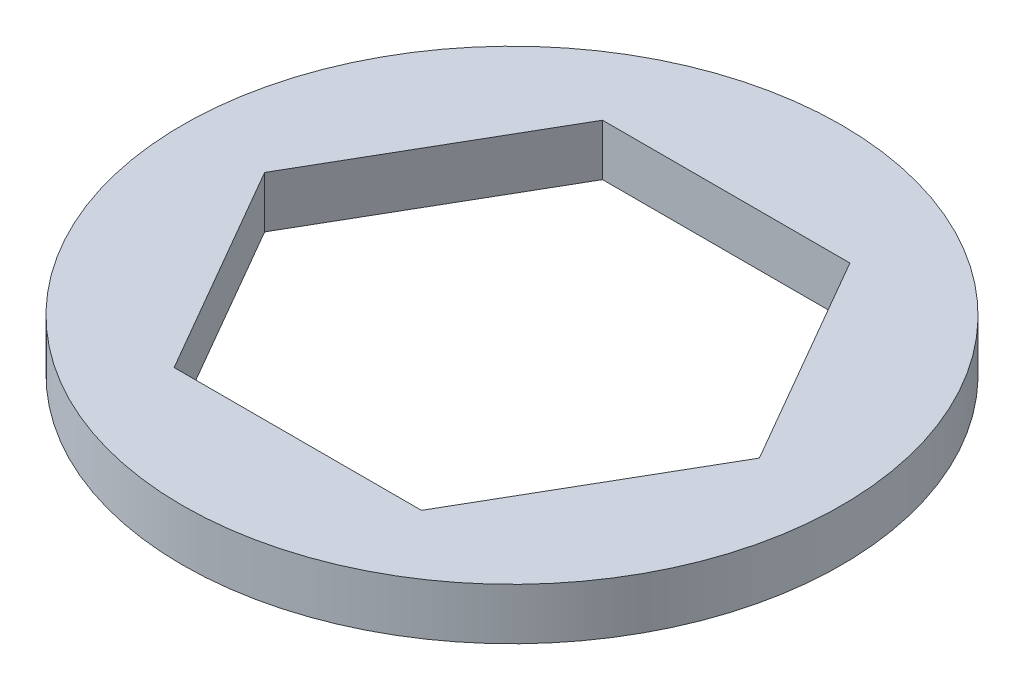
ISO-10303-21;
HEADER;
FILE_DESCRIPTION(('STEP AP214'),'2;1');
FILE_NAME('part.step','',(''),(''),'','','');
FILE_SCHEMA(('AUTOMOTIVE_DESIGN { 1 0 10303 214 1 1 1 1 }'));
ENDSEC;
DATA;
#1=APPLICATION_CONTEXT('core data for automotive mechanical design processes');
#2=APPLICATION_PROTOCOL_DEFINITION('international standard','automotive_design',2000,#1);
#3=PRODUCT_CONTEXT('',#1,'mechanical');
#4=PRODUCT('Part','Part','',(#3));
#5=PRODUCT_RELATED_PRODUCT_CATEGORY('part','',(#4));
#6=PRODUCT_DEFINITION_FORMATION('','',#4);
#7=PRODUCT_DEFINITION_CONTEXT('part definition',#1,'design');
#8=PRODUCT_DEFINITION('design','',#6,#7);
#9=PRODUCT_DEFINITION_SHAPE('','',#8);
#10=(LENGTH_UNIT() NAMED_UNIT(*) SI_UNIT(.MILLI.,.METRE.));
#11=(NAMED_UNIT(*) PLANE_ANGLE_UNIT() SI_UNIT($,.RADIAN.));
#12=(NAMED_UNIT(*) SI_UNIT($,.STERADIAN.) SOLID_ANGLE_UNIT());
#13=UNCERTAINTY_MEASURE_WITH_UNIT(LENGTH_MEASURE(1.E-05),#10,'distance_accuracy_value','');
#14=(GEOMETRIC_REPRESENTATION_CONTEXT(3) GLOBAL_UNCERTAINTY_ASSIGNED_CONTEXT((#13)) GLOBAL_UNIT_ASSIGNED_CONTEXT((#10,
#11,#12)) REPRESENTATION_CONTEXT('',''));
#15=CARTESIAN_POINT('',(0.,0.,0.));
#16=DIRECTION('',(0.,0.,1.));
#17=DIRECTION('',(1.,0.,0.));
#18=AXIS2_PLACEMENT_3D('',#15,#16,#17);
#19=CARTESIAN_POINT('',(0.,0.79375,0.));
#20=DIRECTION('',(0.,1.,0.));
#21=DIRECTION('',(0.,0.,1.));
#22=AXIS2_PLACEMENT_3D('',#19,#20,#21);
#23=PLANE('',#22);
#24=CARTESIAN_POINT('',(0.,0.79375,0.));
#25=DIRECTION('',(0.,1.,0.));
#26=DIRECTION('',(0.,0.,1.));
#27=AXIS2_PLACEMENT_3D('',#24,#25,#26);
#28=CIRCLE('',#27,10.16);
#29=CARTESIAN_POINT('',(0.,0.79375,10.16));
#30=VERTEX_POINT('',#29);
#31=EDGE_CURVE('E11',#30,#30,#28,.T.);
#32=ORIENTED_EDGE('',*,*,#31,.T.);
#33=EDGE_LOOP('',(#32));
#34=FACE_BOUND('',#33,.T.);
#35=DIRECTION('',(-0.5,0.,-0.866025403784439));
#36=VECTOR('',#35,1.);
#37=CARTESIAN_POINT('',(7.62564235545658,0.79375,0.));
#38=LINE('',#37,#36);
#39=CARTESIAN_POINT('',(7.62564235545658,0.79375,0.));
#40=VERTEX_POINT('',#39);
#41=CARTESIAN_POINT('',(3.81282117772829,0.79375,-6.604));
#42=VERTEX_POINT('',#41);
#43=EDGE_CURVE('E98',#40,#42,#38,.T.);
#44=ORIENTED_EDGE('',*,*,#43,.F.);
#45=DIRECTION('',(0.5,0.,-0.866025403784439));
#46=VECTOR('',#45,1.);
#47=CARTESIAN_POINT('',(3.81282117772829,0.79375,6.604));
#48=LINE('',#47,#46);
#49=CARTESIAN_POINT('',(3.81282117772829,0.79375,6.604));
#50=VERTEX_POINT('',#49);
#51=EDGE_CURVE('E90',#50,#40,#48,.T.);
#52=ORIENTED_EDGE('',*,*,#51,.F.);
#53=DIRECTION('',(1.,0.,0.));
#54=VECTOR('',#53,1.);
#55=CARTESIAN_POINT('',(-3.81282117772829,0.79375,6.604));
#56=LINE('',#55,#54);
#57=CARTESIAN_POINT('',(-3.81282117772829,0.79375,6.604));
#58=VERTEX_POINT('',#57);
#59=EDGE_CURVE('E118',#58,#50,#56,.T.);
#60=ORIENTED_EDGE('',*,*,#59,.F.);
#61=DIRECTION('',(0.5,0.,0.866025403784439));
#62=VECTOR('',#61,1.);
#63=CARTESIAN_POINT('',(-7.62564235545658,0.79375,0.));
#64=LINE('',#63,#62);
#65=CARTESIAN_POINT('',(-7.62564235545658,0.79375,0.));
#66=VERTEX_POINT('',#65);
#67=EDGE_CURVE('E116',#66,#58,#64,.T.);
#68=ORIENTED_EDGE('',*,*,#67,.F.);
#69=DIRECTION('',(-0.5,0.,0.866025403784439));
#70=VECTOR('',#69,1.);
#71=CARTESIAN_POINT('',(-3.81282117772829,0.79375,-6.604));
#72=LINE('',#71,#70);
#73=CARTESIAN_POINT('',(-3.81282117772829,0.79375,-6.604));
#74=VERTEX_POINT('',#73);
#75=EDGE_CURVE('E112',#74,#66,#72,.T.);
#76=ORIENTED_EDGE('',*,*,#75,.F.);
#77=DIRECTION('',(-1.,0.,0.));
#78=VECTOR('',#77,1.);
#79=CARTESIAN_POINT('',(3.81282117772829,0.79375,-6.604));
#80=LINE('',#79,#78);
#81=EDGE_CURVE('E110',#42,#74,#80,.T.);
#82=ORIENTED_EDGE('',*,*,#81,.F.);
#83=EDGE_LOOP('',(#44,#52,#60,#68,#76,#82));
#84=FACE_BOUND('',#83,.T.);
#85=ADVANCED_FACE('F37',(#34,#84),#23,.T.);
#86=CARTESIAN_POINT('',(0.,-0.79375,0.));
#87=DIRECTION('',(0.,1.,0.));
#88=DIRECTION('',(0.,0.,1.));
#89=AXIS2_PLACEMENT_3D('',#86,#87,#88);
#90=PLANE('',#89);
#91=CARTESIAN_POINT('',(0.,-0.79375,0.));
#92=DIRECTION('',(0.,1.,0.));
#93=DIRECTION('',(0.,0.,1.));
#94=AXIS2_PLACEMENT_3D('',#91,#92,#93);
#95=CIRCLE('',#94,10.16);
#96=CARTESIAN_POINT('',(0.,-0.79375,10.16));
#97=VERTEX_POINT('',#96);
#98=EDGE_CURVE('E41',#97,#97,#95,.T.);
#99=ORIENTED_EDGE('',*,*,#98,.F.);
#100=EDGE_LOOP('',(#99));
#101=FACE_BOUND('',#100,.T.);
#102=DIRECTION('',(0.5,0.,-0.866025403784439));
#103=VECTOR('',#102,1.);
#104=CARTESIAN_POINT('',(3.81282117772829,-0.79375,6.604));
#105=LINE('',#104,#103);
#106=CARTESIAN_POINT('',(3.81282117772829,-0.79375,6.604));
#107=VERTEX_POINT('',#106);
#108=CARTESIAN_POINT('',(7.62564235545658,-0.79375,0.));
#109=VERTEX_POINT('',#108);
#110=EDGE_CURVE('E60',#107,#109,#105,.T.);
#111=ORIENTED_EDGE('',*,*,#110,.T.);
#112=DIRECTION('',(-0.5,0.,-0.866025403784439));
#113=VECTOR('',#112,1.);
#114=CARTESIAN_POINT('',(7.62564235545658,-0.79375,0.));
#115=LINE('',#114,#113);
#116=CARTESIAN_POINT('',(3.81282117772829,-0.79375,-6.604));
#117=VERTEX_POINT('',#116);
#118=EDGE_CURVE('E105',#109,#117,#115,.T.);
#119=ORIENTED_EDGE('',*,*,#118,.T.);
#120=DIRECTION('',(-1.,0.,0.));
#121=VECTOR('',#120,1.);
#122=CARTESIAN_POINT('',(3.81282117772829,-0.79375,-6.604));
#123=LINE('',#122,#121);
#124=CARTESIAN_POINT('',(-3.81282117772829,-0.79375,-6.604));
#125=VERTEX_POINT('',#124);
#126=EDGE_CURVE('E122',#117,#125,#123,.T.);
#127=ORIENTED_EDGE('',*,*,#126,.T.);
#128=DIRECTION('',(-0.5,0.,0.866025403784439));
#129=VECTOR('',#128,1.);
#130=CARTESIAN_POINT('',(-3.81282117772829,-0.79375,-6.604));
#131=LINE('',#130,#129);
#132=CARTESIAN_POINT('',(-7.62564235545658,-0.79375,0.));
#133=VERTEX_POINT('',#132);
#134=EDGE_CURVE('E125',#125,#133,#131,.T.);
#135=ORIENTED_EDGE('',*,*,#134,.T.);
#136=DIRECTION('',(0.5,0.,0.866025403784439));
#137=VECTOR('',#136,1.);
#138=CARTESIAN_POINT('',(-7.62564235545658,-0.79375,0.));
#139=LINE('',#138,#137);
#140=CARTESIAN_POINT('',(-3.81282117772829,-0.79375,6.604));
#141=VERTEX_POINT('',#140);
#142=EDGE_CURVE('E128',#133,#141,#139,.T.);
#143=ORIENTED_EDGE('',*,*,#142,.T.);
#144=DIRECTION('',(1.,0.,0.));
#145=VECTOR('',#144,1.);
#146=CARTESIAN_POINT('',(-3.81282117772829,-0.79375,6.604));
#147=LINE('',#146,#145);
#148=EDGE_CURVE('E99',#141,#107,#147,.T.);
#149=ORIENTED_EDGE('',*,*,#148,.T.);
#150=EDGE_LOOP('',(#111,#119,#127,#135,#143,#149));
#151=FACE_BOUND('',#150,.T.);
#152=ADVANCED_FACE('F145',(#101,#151),#90,.F.);
#153=CARTESIAN_POINT('',(0.,0.79375,0.));
#154=DIRECTION('',(0.,-1.,0.));
#155=DIRECTION('',(0.,0.,-1.));
#156=AXIS2_PLACEMENT_3D('',#153,#154,#155);
#157=CYLINDRICAL_SURFACE('',#156,10.16);
#158=ORIENTED_EDGE('',*,*,#31,.F.);
#159=EDGE_LOOP('',(#158));
#160=FACE_BOUND('',#159,.T.);
#161=ORIENTED_EDGE('',*,*,#98,.T.);
#162=EDGE_LOOP('',(#161));
#163=FACE_BOUND('',#162,.T.);
#164=ADVANCED_FACE('F39',(#160,#163),#157,.T.);
#165=CARTESIAN_POINT('',(3.81282117772829,0.79375,6.604));
#166=DIRECTION('',(-0.866025403784439,0.,-0.5));
#167=DIRECTION('',(-0.5,0.,0.866025403784439));
#168=AXIS2_PLACEMENT_3D('',#165,#166,#167);
#169=PLANE('',#168);
#170=ORIENTED_EDGE('',*,*,#110,.F.);
#171=DIRECTION('',(0.,-1.,0.));
#172=VECTOR('',#171,1.);
#173=CARTESIAN_POINT('',(3.81282117772829,0.79375,6.604));
#174=LINE('',#173,#172);
#175=EDGE_CURVE('E94',#50,#107,#174,.T.);
#176=ORIENTED_EDGE('',*,*,#175,.F.);
#177=ORIENTED_EDGE('',*,*,#51,.T.);
#178=DIRECTION('',(0.,-1.,0.));
#179=VECTOR('',#178,1.);
#180=CARTESIAN_POINT('',(7.62564235545658,0.79375,0.));
#181=LINE('',#180,#179);
#182=EDGE_CURVE('E93',#40,#109,#181,.T.);
#183=ORIENTED_EDGE('',*,*,#182,.T.);
#184=EDGE_LOOP('',(#170,#176,#177,#183));
#185=FACE_BOUND('',#184,.T.);
#186=ADVANCED_FACE('F92',(#185),#169,.T.);
#187=CARTESIAN_POINT('',(7.62564235545658,0.79375,0.));
#188=DIRECTION('',(-0.866025403784439,0.,0.5));
#189=DIRECTION('',(0.5,0.,0.866025403784439));
#190=AXIS2_PLACEMENT_3D('',#187,#188,#189);
#191=PLANE('',#190);
#192=ORIENTED_EDGE('',*,*,#118,.F.);
#193=ORIENTED_EDGE('',*,*,#182,.F.);
#194=ORIENTED_EDGE('',*,*,#43,.T.);
#195=DIRECTION('',(0.,-1.,0.));
#196=VECTOR('',#195,1.);
#197=CARTESIAN_POINT('',(3.81282117772829,0.79375,-6.604));
#198=LINE('',#197,#196);
#199=EDGE_CURVE('E106',#42,#117,#198,.T.);
#200=ORIENTED_EDGE('',*,*,#199,.T.);
#201=EDGE_LOOP('',(#192,#193,#194,#200));
#202=FACE_BOUND('',#201,.T.);
#203=ADVANCED_FACE('F102',(#202),#191,.T.);
#204=CARTESIAN_POINT('',(3.81282117772829,0.79375,-6.604));
#205=DIRECTION('',(0.,0.,1.));
#206=DIRECTION('',(1.,0.,0.));
#207=AXIS2_PLACEMENT_3D('',#204,#205,#206);
#208=PLANE('',#207);
#209=ORIENTED_EDGE('',*,*,#126,.F.);
#210=ORIENTED_EDGE('',*,*,#199,.F.);
#211=ORIENTED_EDGE('',*,*,#81,.T.);
#212=DIRECTION('',(0.,-1.,0.));
#213=VECTOR('',#212,1.);
#214=CARTESIAN_POINT('',(-3.81282117772829,0.79375,-6.604));
#215=LINE('',#214,#213);
#216=EDGE_CURVE('E137',#74,#125,#215,.T.);
#217=ORIENTED_EDGE('',*,*,#216,.T.);
#218=EDGE_LOOP('',(#209,#210,#211,#217));
#219=FACE_BOUND('',#218,.T.);
#220=ADVANCED_FACE('F141',(#219),#208,.T.);
#221=CARTESIAN_POINT('',(-3.81282117772829,0.79375,-6.604));
#222=DIRECTION('',(0.866025403784439,0.,0.5));
#223=DIRECTION('',(0.5,0.,-0.866025403784439));
#224=AXIS2_PLACEMENT_3D('',#221,#222,#223);
#225=PLANE('',#224);
#226=ORIENTED_EDGE('',*,*,#134,.F.);
#227=ORIENTED_EDGE('',*,*,#216,.F.);
#228=ORIENTED_EDGE('',*,*,#75,.T.);
#229=DIRECTION('',(0.,-1.,0.));
#230=VECTOR('',#229,1.);
#231=CARTESIAN_POINT('',(-7.62564235545658,0.79375,0.));
#232=LINE('',#231,#230);
#233=EDGE_CURVE('E135',#66,#133,#232,.T.);
#234=ORIENTED_EDGE('',*,*,#233,.T.);
#235=EDGE_LOOP('',(#226,#227,#228,#234));
#236=FACE_BOUND('',#235,.T.);
#237=ADVANCED_FACE('F153',(#236),#225,.T.);
#238=CARTESIAN_POINT('',(-7.62564235545658,0.79375,0.));
#239=DIRECTION('',(0.866025403784439,0.,-0.5));
#240=DIRECTION('',(-0.5,0.,-0.866025403784439));
#241=AXIS2_PLACEMENT_3D('',#238,#239,#240);
#242=PLANE('',#241);
#243=ORIENTED_EDGE('',*,*,#142,.F.);
#244=ORIENTED_EDGE('',*,*,#233,.F.);
#245=ORIENTED_EDGE('',*,*,#67,.T.);
#246=DIRECTION('',(0.,-1.,0.));
#247=VECTOR('',#246,1.);
#248=CARTESIAN_POINT('',(-3.81282117772829,0.79375,6.604));
#249=LINE('',#248,#247);
#250=EDGE_CURVE('E52',#58,#141,#249,.T.);
#251=ORIENTED_EDGE('',*,*,#250,.T.);
#252=EDGE_LOOP('',(#243,#244,#245,#251));
#253=FACE_BOUND('',#252,.T.);
#254=ADVANCED_FACE('F151',(#253),#242,.T.);
#255=CARTESIAN_POINT('',(-3.81282117772829,0.79375,6.604));
#256=DIRECTION('',(0.,0.,-1.));
#257=DIRECTION('',(-1.,0.,0.));
#258=AXIS2_PLACEMENT_3D('',#255,#256,#257);
#259=PLANE('',#258);
#260=ORIENTED_EDGE('',*,*,#148,.F.);
#261=ORIENTED_EDGE('',*,*,#250,.F.);
#262=ORIENTED_EDGE('',*,*,#59,.T.);
#263=ORIENTED_EDGE('',*,*,#175,.T.);
#264=EDGE_LOOP('',(#260,#261,#262,#263));
#265=FACE_BOUND('',#264,.T.);
#266=ADVANCED_FACE('F147',(#265),#259,.T.);
#267=CLOSED_SHELL('',(#85,#152,#164,#186,#203,#220,#237,#254,#266));
#268=MANIFOLD_SOLID_BREP('B2',#267);
#269=ADVANCED_BREP_SHAPE_REPRESENTATION('',(#18,#268),#14);
#270=SHAPE_DEFINITION_REPRESENTATION(#9,#269);
ENDSEC;
END-ISO-10303-21;
